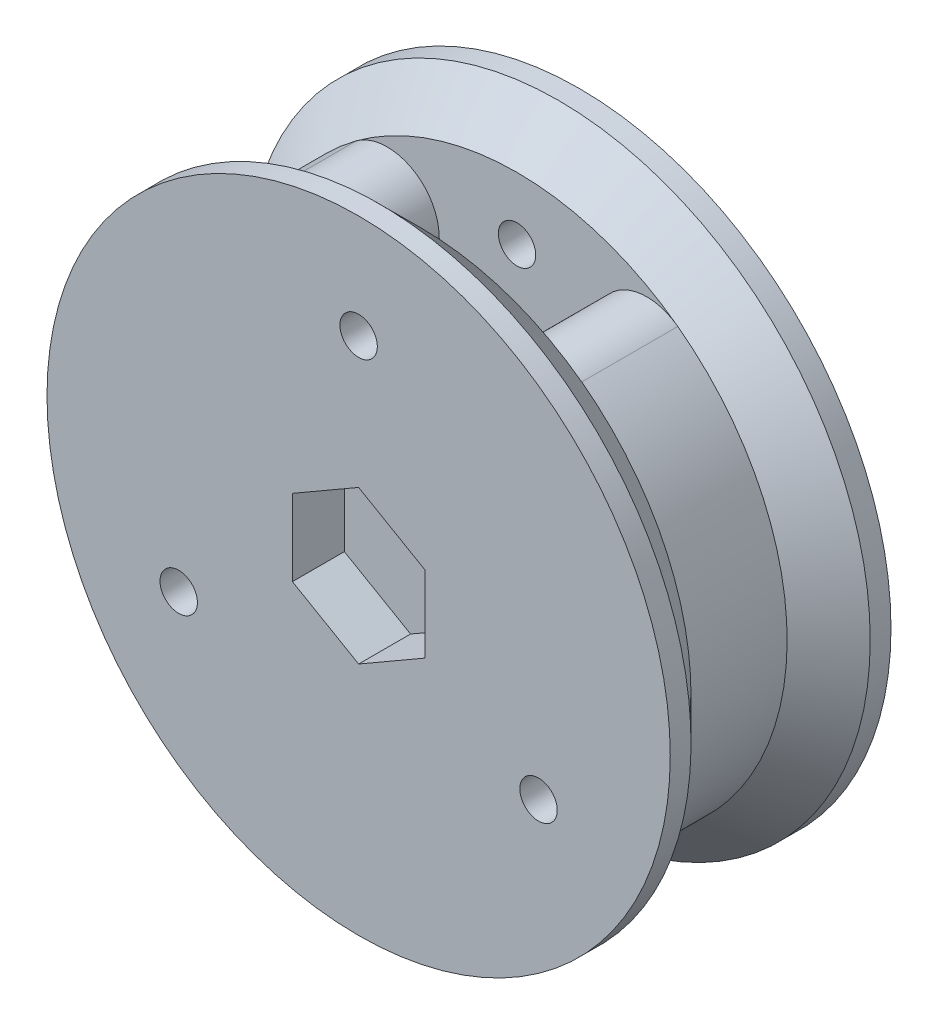
ISO-10303-21;
HEADER;
FILE_DESCRIPTION(('STEP AP214'),'2;1');
FILE_NAME('part.step','',(''),(''),'','','');
FILE_SCHEMA(('AUTOMOTIVE_DESIGN { 1 0 10303 214 1 1 1 1 }'));
ENDSEC;
DATA;
#1=APPLICATION_CONTEXT('core data for automotive mechanical design processes');
#2=APPLICATION_PROTOCOL_DEFINITION('international standard','automotive_design',2000,#1);
#3=PRODUCT_CONTEXT('',#1,'mechanical');
#4=PRODUCT('Part','Part','',(#3));
#5=PRODUCT_RELATED_PRODUCT_CATEGORY('part','',(#4));
#6=PRODUCT_DEFINITION_FORMATION('','',#4);
#7=PRODUCT_DEFINITION_CONTEXT('part definition',#1,'design');
#8=PRODUCT_DEFINITION('design','',#6,#7);
#9=PRODUCT_DEFINITION_SHAPE('','',#8);
#10=(LENGTH_UNIT() NAMED_UNIT(*) SI_UNIT(.MILLI.,.METRE.));
#11=(NAMED_UNIT(*) PLANE_ANGLE_UNIT() SI_UNIT($,.RADIAN.));
#12=(NAMED_UNIT(*) SI_UNIT($,.STERADIAN.) SOLID_ANGLE_UNIT());
#13=UNCERTAINTY_MEASURE_WITH_UNIT(LENGTH_MEASURE(1.E-05),#10,'distance_accuracy_value','');
#14=(GEOMETRIC_REPRESENTATION_CONTEXT(3) GLOBAL_UNCERTAINTY_ASSIGNED_CONTEXT((#13)) GLOBAL_UNIT_ASSIGNED_CONTEXT((#10,
#11,#12)) REPRESENTATION_CONTEXT('',''));
#15=CARTESIAN_POINT('',(0.,0.,0.));
#16=DIRECTION('',(0.,0.,1.));
#17=DIRECTION('',(1.,0.,0.));
#18=AXIS2_PLACEMENT_3D('',#15,#16,#17);
#19=CARTESIAN_POINT('',(0.,20.,0.));
#20=DIRECTION('',(0.,0.,1.));
#21=DIRECTION('',(1.,0.,0.));
#22=AXIS2_PLACEMENT_3D('',#19,#20,#21);
#23=CYLINDRICAL_SURFACE('',#22,1.8);
#24=CARTESIAN_POINT('',(0.,20.,6.00000000000006));
#25=DIRECTION('',(0.,0.,-1.));
#26=DIRECTION('',(-1.,0.,0.));
#27=AXIS2_PLACEMENT_3D('',#24,#25,#26);
#28=CIRCLE('',#27,1.8);
#29=CARTESIAN_POINT('',(-1.8,20.,6.00000000000006));
#30=VERTEX_POINT('',#29);
#31=EDGE_CURVE('E204',#30,#30,#28,.F.);
#32=ORIENTED_EDGE('',*,*,#31,.T.);
#33=EDGE_LOOP('',(#32));
#34=FACE_BOUND('',#33,.T.);
#35=CARTESIAN_POINT('',(0.,20.,0.));
#36=DIRECTION('',(0.,0.,1.));
#37=DIRECTION('',(1.,0.,0.));
#38=AXIS2_PLACEMENT_3D('',#35,#36,#37);
#39=CIRCLE('',#38,1.8);
#40=CARTESIAN_POINT('',(1.8,20.,0.));
#41=VERTEX_POINT('',#40);
#42=EDGE_CURVE('E231',#41,#41,#39,.T.);
#43=ORIENTED_EDGE('',*,*,#42,.F.);
#44=EDGE_LOOP('',(#43));
#45=FACE_BOUND('',#44,.T.);
#46=ADVANCED_FACE('F35',(#34,#45),#23,.F.);
#47=CARTESIAN_POINT('',(0.,0.,21.25));
#48=DIRECTION('',(0.,0.,-1.));
#49=DIRECTION('',(-1.,0.,0.));
#50=AXIS2_PLACEMENT_3D('',#47,#48,#49);
#51=CYLINDRICAL_SURFACE('',#50,30.);
#52=CARTESIAN_POINT('',(0.,0.,19.25));
#53=DIRECTION('',(0.,0.,-1.));
#54=DIRECTION('',(-1.,0.,0.));
#55=AXIS2_PLACEMENT_3D('',#52,#53,#54);
#56=CIRCLE('',#55,30.);
#57=CARTESIAN_POINT('',(-30.,0.,19.25));
#58=VERTEX_POINT('',#57);
#59=EDGE_CURVE('E244',#58,#58,#56,.T.);
#60=ORIENTED_EDGE('',*,*,#59,.F.);
#61=EDGE_LOOP('',(#60));
#62=FACE_BOUND('',#61,.T.);
#63=CARTESIAN_POINT('',(0.,0.,21.25));
#64=DIRECTION('',(0.,0.,1.));
#65=DIRECTION('',(1.,0.,0.));
#66=AXIS2_PLACEMENT_3D('',#63,#64,#65);
#67=CIRCLE('',#66,30.);
#68=CARTESIAN_POINT('',(30.,0.,21.25));
#69=VERTEX_POINT('',#68);
#70=EDGE_CURVE('E303',#69,#69,#67,.T.);
#71=ORIENTED_EDGE('',*,*,#70,.F.);
#72=EDGE_LOOP('',(#71));
#73=FACE_BOUND('',#72,.T.);
#74=ADVANCED_FACE('F388',(#62,#73),#51,.T.);
#75=CARTESIAN_POINT('',(0.,0.,21.25));
#76=DIRECTION('',(0.,0.,1.));
#77=DIRECTION('',(1.,0.,0.));
#78=AXIS2_PLACEMENT_3D('',#75,#76,#77);
#79=PLANE('',#78);
#80=CARTESIAN_POINT('',(-17.3205080756887,-10.0000000000001,21.25));
#81=DIRECTION('',(0.,0.,1.));
#82=DIRECTION('',(1.,0.,0.));
#83=AXIS2_PLACEMENT_3D('',#80,#81,#82);
#84=CIRCLE('',#83,1.8);
#85=CARTESIAN_POINT('',(-15.5205080756887,-10.0000000000001,21.25));
#86=VERTEX_POINT('',#85);
#87=EDGE_CURVE('E228',#86,#86,#84,.T.);
#88=ORIENTED_EDGE('',*,*,#87,.F.);
#89=EDGE_LOOP('',(#88));
#90=FACE_BOUND('',#89,.T.);
#91=CARTESIAN_POINT('',(0.,20.,21.25));
#92=DIRECTION('',(0.,0.,1.));
#93=DIRECTION('',(1.,0.,0.));
#94=AXIS2_PLACEMENT_3D('',#91,#92,#93);
#95=CIRCLE('',#94,1.8);
#96=CARTESIAN_POINT('',(1.8,20.,21.25));
#97=VERTEX_POINT('',#96);
#98=EDGE_CURVE('E234',#97,#97,#95,.T.);
#99=ORIENTED_EDGE('',*,*,#98,.F.);
#100=EDGE_LOOP('',(#99));
#101=FACE_BOUND('',#100,.T.);
#102=CARTESIAN_POINT('',(17.3205080756889,-9.99999999999983,21.25));
#103=DIRECTION('',(0.,0.,1.));
#104=DIRECTION('',(1.,0.,0.));
#105=AXIS2_PLACEMENT_3D('',#102,#103,#104);
#106=CIRCLE('',#105,1.8);
#107=CARTESIAN_POINT('',(19.1205080756889,-9.99999999999983,21.25));
#108=VERTEX_POINT('',#107);
#109=EDGE_CURVE('E216',#108,#108,#106,.T.);
#110=ORIENTED_EDGE('',*,*,#109,.F.);
#111=EDGE_LOOP('',(#110));
#112=FACE_BOUND('',#111,.T.);
#113=DIRECTION('',(-0.866025403784439,0.5,0.));
#114=VECTOR('',#113,1.);
#115=CARTESIAN_POINT('',(6.375,3.68060796608387,21.25));
#116=LINE('',#115,#114);
#117=CARTESIAN_POINT('',(6.375,3.68060796608387,21.25));
#118=VERTEX_POINT('',#117);
#119=CARTESIAN_POINT('',(0.,7.36121593216773,21.25));
#120=VERTEX_POINT('',#119);
#121=EDGE_CURVE('E254',#118,#120,#116,.T.);
#122=ORIENTED_EDGE('',*,*,#121,.F.);
#123=DIRECTION('',(0.,1.,0.));
#124=VECTOR('',#123,1.);
#125=CARTESIAN_POINT('',(6.375,-3.68060796608386,21.25));
#126=LINE('',#125,#124);
#127=CARTESIAN_POINT('',(6.375,-3.68060796608386,21.25));
#128=VERTEX_POINT('',#127);
#129=EDGE_CURVE('E259',#128,#118,#126,.T.);
#130=ORIENTED_EDGE('',*,*,#129,.F.);
#131=DIRECTION('',(0.866025403784439,0.5,0.));
#132=VECTOR('',#131,1.);
#133=CARTESIAN_POINT('',(0.,-7.36121593216773,21.25));
#134=LINE('',#133,#132);
#135=CARTESIAN_POINT('',(0.,-7.36121593216773,21.25));
#136=VERTEX_POINT('',#135);
#137=EDGE_CURVE('E285',#136,#128,#134,.T.);
#138=ORIENTED_EDGE('',*,*,#137,.F.);
#139=DIRECTION('',(0.866025403784439,-0.5,0.));
#140=VECTOR('',#139,1.);
#141=CARTESIAN_POINT('',(-6.375,-3.68060796608386,21.25));
#142=LINE('',#141,#140);
#143=CARTESIAN_POINT('',(-6.375,-3.68060796608386,21.25));
#144=VERTEX_POINT('',#143);
#145=EDGE_CURVE('E282',#144,#136,#142,.T.);
#146=ORIENTED_EDGE('',*,*,#145,.F.);
#147=DIRECTION('',(0.,-1.,0.));
#148=VECTOR('',#147,1.);
#149=CARTESIAN_POINT('',(-6.375,3.68060796608386,21.25));
#150=LINE('',#149,#148);
#151=CARTESIAN_POINT('',(-6.375,3.68060796608386,21.25));
#152=VERTEX_POINT('',#151);
#153=EDGE_CURVE('E279',#152,#144,#150,.T.);
#154=ORIENTED_EDGE('',*,*,#153,.F.);
#155=DIRECTION('',(-0.866025403784439,-0.5,0.));
#156=VECTOR('',#155,1.);
#157=CARTESIAN_POINT('',(0.,7.36121593216773,21.25));
#158=LINE('',#157,#156);
#159=EDGE_CURVE('E276',#120,#152,#158,.T.);
#160=ORIENTED_EDGE('',*,*,#159,.F.);
#161=EDGE_LOOP('',(#122,#130,#138,#146,#154,#160));
#162=FACE_BOUND('',#161,.T.);
#163=ORIENTED_EDGE('',*,*,#70,.T.);
#164=EDGE_LOOP('',(#163));
#165=FACE_BOUND('',#164,.T.);
#166=ADVANCED_FACE('F395',(#90,#101,#112,#162,#165),#79,.T.);
#167=CARTESIAN_POINT('',(6.375,3.68060796608387,16.25));
#168=DIRECTION('',(0.5,0.866025403784439,0.));
#169=DIRECTION('',(-0.866025403784439,0.5,0.));
#170=AXIS2_PLACEMENT_3D('',#167,#168,#169);
#171=PLANE('',#170);
#172=ORIENTED_EDGE('',*,*,#121,.T.);
#173=DIRECTION('',(0.,0.,1.));
#174=VECTOR('',#173,1.);
#175=CARTESIAN_POINT('',(0.,7.36121593216773,16.25));
#176=LINE('',#175,#174);
#177=CARTESIAN_POINT('',(0.,7.36121593216773,16.25));
#178=VERTEX_POINT('',#177);
#179=EDGE_CURVE('E274',#178,#120,#176,.T.);
#180=ORIENTED_EDGE('',*,*,#179,.F.);
#181=DIRECTION('',(-0.866025403784439,0.5,0.));
#182=VECTOR('',#181,1.);
#183=CARTESIAN_POINT('',(6.375,3.68060796608387,16.25));
#184=LINE('',#183,#182);
#185=CARTESIAN_POINT('',(6.375,3.68060796608387,16.25));
#186=VERTEX_POINT('',#185);
#187=EDGE_CURVE('E255',#186,#178,#184,.T.);
#188=ORIENTED_EDGE('',*,*,#187,.F.);
#189=DIRECTION('',(0.,0.,1.));
#190=VECTOR('',#189,1.);
#191=CARTESIAN_POINT('',(6.375,3.68060796608387,16.25));
#192=LINE('',#191,#190);
#193=EDGE_CURVE('E290',#186,#118,#192,.T.);
#194=ORIENTED_EDGE('',*,*,#193,.T.);
#195=EDGE_LOOP('',(#172,#180,#188,#194));
#196=FACE_BOUND('',#195,.T.);
#197=ADVANCED_FACE('F418',(#196),#171,.F.);
#198=CARTESIAN_POINT('',(6.375,-3.68060796608386,16.25));
#199=DIRECTION('',(1.,0.,0.));
#200=DIRECTION('',(0.,1.,0.));
#201=AXIS2_PLACEMENT_3D('',#198,#199,#200);
#202=PLANE('',#201);
#203=ORIENTED_EDGE('',*,*,#129,.T.);
#204=ORIENTED_EDGE('',*,*,#193,.F.);
#205=DIRECTION('',(0.,1.,0.));
#206=VECTOR('',#205,1.);
#207=CARTESIAN_POINT('',(6.375,-3.68060796608386,16.25));
#208=LINE('',#207,#206);
#209=CARTESIAN_POINT('',(6.375,-3.68060796608386,16.25));
#210=VERTEX_POINT('',#209);
#211=EDGE_CURVE('E271',#210,#186,#208,.T.);
#212=ORIENTED_EDGE('',*,*,#211,.F.);
#213=DIRECTION('',(0.,0.,1.));
#214=VECTOR('',#213,1.);
#215=CARTESIAN_POINT('',(6.375,-3.68060796608386,16.25));
#216=LINE('',#215,#214);
#217=EDGE_CURVE('E293',#210,#128,#216,.T.);
#218=ORIENTED_EDGE('',*,*,#217,.T.);
#219=EDGE_LOOP('',(#203,#204,#212,#218));
#220=FACE_BOUND('',#219,.T.);
#221=ADVANCED_FACE('F439',(#220),#202,.F.);
#222=CARTESIAN_POINT('',(0.,-7.36121593216773,16.25));
#223=DIRECTION('',(0.5,-0.866025403784439,0.));
#224=DIRECTION('',(0.866025403784439,0.5,0.));
#225=AXIS2_PLACEMENT_3D('',#222,#223,#224);
#226=PLANE('',#225);
#227=ORIENTED_EDGE('',*,*,#137,.T.);
#228=ORIENTED_EDGE('',*,*,#217,.F.);
#229=DIRECTION('',(0.866025403784439,0.5,0.));
#230=VECTOR('',#229,1.);
#231=CARTESIAN_POINT('',(0.,-7.36121593216773,16.25));
#232=LINE('',#231,#230);
#233=CARTESIAN_POINT('',(0.,-7.36121593216773,16.25));
#234=VERTEX_POINT('',#233);
#235=EDGE_CURVE('E268',#234,#210,#232,.T.);
#236=ORIENTED_EDGE('',*,*,#235,.F.);
#237=DIRECTION('',(0.,0.,1.));
#238=VECTOR('',#237,1.);
#239=CARTESIAN_POINT('',(0.,-7.36121593216773,16.25));
#240=LINE('',#239,#238);
#241=EDGE_CURVE('E295',#234,#136,#240,.T.);
#242=ORIENTED_EDGE('',*,*,#241,.T.);
#243=EDGE_LOOP('',(#227,#228,#236,#242));
#244=FACE_BOUND('',#243,.T.);
#245=ADVANCED_FACE('F441',(#244),#226,.F.);
#246=CARTESIAN_POINT('',(-6.375,-3.68060796608386,16.25));
#247=DIRECTION('',(-0.5,-0.866025403784439,0.));
#248=DIRECTION('',(0.866025403784439,-0.5,0.));
#249=AXIS2_PLACEMENT_3D('',#246,#247,#248);
#250=PLANE('',#249);
#251=ORIENTED_EDGE('',*,*,#145,.T.);
#252=ORIENTED_EDGE('',*,*,#241,.F.);
#253=DIRECTION('',(0.866025403784439,-0.5,0.));
#254=VECTOR('',#253,1.);
#255=CARTESIAN_POINT('',(-6.375,-3.68060796608386,16.25));
#256=LINE('',#255,#254);
#257=CARTESIAN_POINT('',(-6.375,-3.68060796608386,16.25));
#258=VERTEX_POINT('',#257);
#259=EDGE_CURVE('E265',#258,#234,#256,.T.);
#260=ORIENTED_EDGE('',*,*,#259,.F.);
#261=DIRECTION('',(0.,0.,1.));
#262=VECTOR('',#261,1.);
#263=CARTESIAN_POINT('',(-6.375,-3.68060796608386,16.25));
#264=LINE('',#263,#262);
#265=EDGE_CURVE('E297',#258,#144,#264,.T.);
#266=ORIENTED_EDGE('',*,*,#265,.T.);
#267=EDGE_LOOP('',(#251,#252,#260,#266));
#268=FACE_BOUND('',#267,.T.);
#269=ADVANCED_FACE('F444',(#268),#250,.F.);
#270=CARTESIAN_POINT('',(-6.375,3.68060796608386,16.25));
#271=DIRECTION('',(-1.,0.,0.));
#272=DIRECTION('',(0.,0.,1.));
#273=AXIS2_PLACEMENT_3D('',#270,#271,#272);
#274=PLANE('',#273);
#275=ORIENTED_EDGE('',*,*,#153,.T.);
#276=ORIENTED_EDGE('',*,*,#265,.F.);
#277=DIRECTION('',(0.,-1.,0.));
#278=VECTOR('',#277,1.);
#279=CARTESIAN_POINT('',(-6.375,3.68060796608386,16.25));
#280=LINE('',#279,#278);
#281=CARTESIAN_POINT('',(-6.375,3.68060796608386,16.25));
#282=VERTEX_POINT('',#281);
#283=EDGE_CURVE('E262',#282,#258,#280,.T.);
#284=ORIENTED_EDGE('',*,*,#283,.F.);
#285=DIRECTION('',(0.,0.,1.));
#286=VECTOR('',#285,1.);
#287=CARTESIAN_POINT('',(-6.375,3.68060796608386,16.25));
#288=LINE('',#287,#286);
#289=EDGE_CURVE('E299',#282,#152,#288,.T.);
#290=ORIENTED_EDGE('',*,*,#289,.T.);
#291=EDGE_LOOP('',(#275,#276,#284,#290));
#292=FACE_BOUND('',#291,.T.);
#293=ADVANCED_FACE('F447',(#292),#274,.F.);
#294=CARTESIAN_POINT('',(0.,7.36121593216773,16.25));
#295=DIRECTION('',(-0.5,0.866025403784439,0.));
#296=DIRECTION('',(-0.866025403784439,-0.5,0.));
#297=AXIS2_PLACEMENT_3D('',#294,#295,#296);
#298=PLANE('',#297);
#299=ORIENTED_EDGE('',*,*,#159,.T.);
#300=ORIENTED_EDGE('',*,*,#289,.F.);
#301=DIRECTION('',(-0.866025403784439,-0.5,0.));
#302=VECTOR('',#301,1.);
#303=CARTESIAN_POINT('',(0.,7.36121593216773,16.25));
#304=LINE('',#303,#302);
#305=EDGE_CURVE('E258',#178,#282,#304,.T.);
#306=ORIENTED_EDGE('',*,*,#305,.F.);
#307=ORIENTED_EDGE('',*,*,#179,.T.);
#308=EDGE_LOOP('',(#299,#300,#306,#307));
#309=FACE_BOUND('',#308,.T.);
#310=ADVANCED_FACE('F383',(#309),#298,.F.);
#311=CARTESIAN_POINT('',(0.,0.,16.25));
#312=DIRECTION('',(0.,0.,1.));
#313=DIRECTION('',(1.,0.,0.));
#314=AXIS2_PLACEMENT_3D('',#311,#312,#313);
#315=PLANE('',#314);
#316=ORIENTED_EDGE('',*,*,#187,.T.);
#317=ORIENTED_EDGE('',*,*,#305,.T.);
#318=ORIENTED_EDGE('',*,*,#283,.T.);
#319=ORIENTED_EDGE('',*,*,#259,.T.);
#320=ORIENTED_EDGE('',*,*,#235,.T.);
#321=ORIENTED_EDGE('',*,*,#211,.T.);
#322=EDGE_LOOP('',(#316,#317,#318,#319,#320,#321));
#323=FACE_BOUND('',#322,.T.);
#324=ADVANCED_FACE('F375',(#323),#315,.T.);
#325=CARTESIAN_POINT('',(0.,0.,6.00000000000005));
#326=DIRECTION('',(0.,0.,-1.));
#327=DIRECTION('',(-1.,0.,0.));
#328=AXIS2_PLACEMENT_3D('',#325,#326,#327);
#329=CONICAL_SURFACE('',#328,26.,0.785398163397443);
#330=CARTESIAN_POINT('',(0.,0.,2.));
#331=DIRECTION('',(0.,0.,-1.));
#332=DIRECTION('',(-1.,0.,0.));
#333=AXIS2_PLACEMENT_3D('',#330,#331,#332);
#334=CIRCLE('',#333,30.);
#335=CARTESIAN_POINT('',(-30.,0.,2.));
#336=VERTEX_POINT('',#335);
#337=EDGE_CURVE('E227',#336,#336,#334,.T.);
#338=ORIENTED_EDGE('',*,*,#337,.F.);
#339=EDGE_LOOP('',(#338));
#340=FACE_BOUND('',#339,.T.);
#341=CARTESIAN_POINT('',(0.,0.,6.00000000000005));
#342=DIRECTION('',(0.,0.,-1.));
#343=DIRECTION('',(-1.,0.,0.));
#344=AXIS2_PLACEMENT_3D('',#341,#342,#343);
#345=CIRCLE('',#344,26.);
#346=CARTESIAN_POINT('',(-15.4761904761905,20.8922839427543,6.00000000000005));
#347=VERTEX_POINT('',#346);
#348=CARTESIAN_POINT('',(15.4761904761905,20.8922839427543,6.00000000000005));
#349=VERTEX_POINT('',#348);
#350=EDGE_CURVE('E251',#347,#349,#345,.T.);
#351=ORIENTED_EDGE('',*,*,#350,.T.);
#352=EDGE_CURVE('E250',#349,#347,#345,.T.);
#353=ORIENTED_EDGE('',*,*,#352,.T.);
#354=EDGE_LOOP('',(#351,#353));
#355=FACE_BOUND('',#354,.T.);
#356=ADVANCED_FACE('F373',(#340,#355),#329,.T.);
#357=CARTESIAN_POINT('',(0.,0.,-12.6406174798319));
#358=DIRECTION('',(0.,0.,-1.));
#359=DIRECTION('',(-1.,0.,0.));
#360=AXIS2_PLACEMENT_3D('',#357,#358,#359);
#361=CYLINDRICAL_SURFACE('',#360,26.);
#362=ORIENTED_EDGE('',*,*,#352,.F.);
#363=DIRECTION('',(0.,0.,-1.));
#364=VECTOR('',#363,1.);
#365=CARTESIAN_POINT('',(15.4761904761905,20.8922839427543,-12.6406174798319));
#366=LINE('',#365,#364);
#367=CARTESIAN_POINT('',(15.4761904761905,20.8922839427543,15.25));
#368=VERTEX_POINT('',#367);
#369=EDGE_CURVE('E316',#349,#368,#366,.F.);
#370=ORIENTED_EDGE('',*,*,#369,.T.);
#371=CARTESIAN_POINT('',(0.,0.,15.25));
#372=DIRECTION('',(0.,0.,-1.));
#373=DIRECTION('',(-1.,0.,0.));
#374=AXIS2_PLACEMENT_3D('',#371,#372,#373);
#375=CIRCLE('',#374,26.);
#376=CARTESIAN_POINT('',(-15.4761904761905,20.8922839427543,15.25));
#377=VERTEX_POINT('',#376);
#378=EDGE_CURVE('E247',#368,#377,#375,.T.);
#379=ORIENTED_EDGE('',*,*,#378,.T.);
#380=DIRECTION('',(0.,0.,-1.));
#381=VECTOR('',#380,1.);
#382=CARTESIAN_POINT('',(-15.4761904761905,20.8922839427543,-12.6406174798319));
#383=LINE('',#382,#381);
#384=EDGE_CURVE('E306',#377,#347,#383,.T.);
#385=ORIENTED_EDGE('',*,*,#384,.T.);
#386=EDGE_LOOP('',(#362,#370,#379,#385));
#387=FACE_BOUND('',#386,.T.);
#388=ADVANCED_FACE('F359',(#387),#361,.T.);
#389=CARTESIAN_POINT('',(0.,0.,19.25));
#390=DIRECTION('',(0.,0.,1.));
#391=DIRECTION('',(1.,0.,0.));
#392=AXIS2_PLACEMENT_3D('',#389,#390,#391);
#393=CONICAL_SURFACE('',#392,30.,0.785398163397443);
#394=EDGE_CURVE('E248',#377,#368,#375,.T.);
#395=ORIENTED_EDGE('',*,*,#394,.F.);
#396=ORIENTED_EDGE('',*,*,#378,.F.);
#397=EDGE_LOOP('',(#395,#396));
#398=FACE_BOUND('',#397,.T.);
#399=ORIENTED_EDGE('',*,*,#59,.T.);
#400=EDGE_LOOP('',(#399));
#401=FACE_BOUND('',#400,.T.);
#402=ADVANCED_FACE('F364',(#398,#401),#393,.T.);
#403=CARTESIAN_POINT('',(0.,0.,0.));
#404=DIRECTION('',(0.,0.,1.));
#405=DIRECTION('',(1.,0.,0.));
#406=AXIS2_PLACEMENT_3D('',#403,#404,#405);
#407=PLANE('',#406);
#408=DIRECTION('',(0.5,0.866025403784439,0.));
#409=VECTOR('',#408,1.);
#410=CARTESIAN_POINT('',(-7.36121593216773,0.,0.));
#411=LINE('',#410,#409);
#412=CARTESIAN_POINT('',(-7.36121593216773,0.,0.));
#413=VERTEX_POINT('',#412);
#414=CARTESIAN_POINT('',(-3.68060796608386,6.375,0.));
#415=VERTEX_POINT('',#414);
#416=EDGE_CURVE('E203',#413,#415,#411,.T.);
#417=ORIENTED_EDGE('',*,*,#416,.F.);
#418=DIRECTION('',(-0.499999999999999,0.866025403784439,0.));
#419=VECTOR('',#418,1.);
#420=CARTESIAN_POINT('',(-3.68060796608386,-6.375,0.));
#421=LINE('',#420,#419);
#422=CARTESIAN_POINT('',(-3.68060796608386,-6.375,0.));
#423=VERTEX_POINT('',#422);
#424=EDGE_CURVE('E168',#423,#413,#421,.T.);
#425=ORIENTED_EDGE('',*,*,#424,.F.);
#426=DIRECTION('',(-1.,0.,0.));
#427=VECTOR('',#426,1.);
#428=CARTESIAN_POINT('',(3.68060796608387,-6.375,0.));
#429=LINE('',#428,#427);
#430=CARTESIAN_POINT('',(3.68060796608387,-6.375,0.));
#431=VERTEX_POINT('',#430);
#432=EDGE_CURVE('E186',#431,#423,#429,.T.);
#433=ORIENTED_EDGE('',*,*,#432,.F.);
#434=DIRECTION('',(-0.5,-0.866025403784439,0.));
#435=VECTOR('',#434,1.);
#436=CARTESIAN_POINT('',(7.36121593216773,0.,0.));
#437=LINE('',#436,#435);
#438=CARTESIAN_POINT('',(7.36121593216773,0.,0.));
#439=VERTEX_POINT('',#438);
#440=EDGE_CURVE('E189',#439,#431,#437,.T.);
#441=ORIENTED_EDGE('',*,*,#440,.F.);
#442=DIRECTION('',(0.5,-0.866025403784439,0.));
#443=VECTOR('',#442,1.);
#444=CARTESIAN_POINT('',(3.68060796608386,6.375,0.));
#445=LINE('',#444,#443);
#446=CARTESIAN_POINT('',(3.68060796608386,6.375,0.));
#447=VERTEX_POINT('',#446);
#448=EDGE_CURVE('E209',#447,#439,#445,.T.);
#449=ORIENTED_EDGE('',*,*,#448,.F.);
#450=DIRECTION('',(1.,0.,0.));
#451=VECTOR('',#450,1.);
#452=CARTESIAN_POINT('',(-3.68060796608386,6.375,0.));
#453=LINE('',#452,#451);
#454=EDGE_CURVE('E206',#415,#447,#453,.T.);
#455=ORIENTED_EDGE('',*,*,#454,.F.);
#456=EDGE_LOOP('',(#417,#425,#433,#441,#449,#455));
#457=FACE_BOUND('',#456,.T.);
#458=CARTESIAN_POINT('',(-17.3205080756887,-10.0000000000001,0.));
#459=DIRECTION('',(0.,0.,1.));
#460=DIRECTION('',(1.,0.,0.));
#461=AXIS2_PLACEMENT_3D('',#458,#459,#460);
#462=CIRCLE('',#461,1.8);
#463=CARTESIAN_POINT('',(-15.5205080756887,-10.0000000000001,0.));
#464=VERTEX_POINT('',#463);
#465=EDGE_CURVE('E224',#464,#464,#462,.T.);
#466=ORIENTED_EDGE('',*,*,#465,.T.);
#467=EDGE_LOOP('',(#466));
#468=FACE_BOUND('',#467,.T.);
#469=ORIENTED_EDGE('',*,*,#42,.T.);
#470=EDGE_LOOP('',(#469));
#471=FACE_BOUND('',#470,.T.);
#472=CARTESIAN_POINT('',(17.3205080756889,-9.99999999999983,0.));
#473=DIRECTION('',(0.,0.,1.));
#474=DIRECTION('',(1.,0.,0.));
#475=AXIS2_PLACEMENT_3D('',#472,#473,#474);
#476=CIRCLE('',#475,1.8);
#477=CARTESIAN_POINT('',(19.1205080756889,-9.99999999999983,0.));
#478=VERTEX_POINT('',#477);
#479=EDGE_CURVE('E237',#478,#478,#476,.T.);
#480=ORIENTED_EDGE('',*,*,#479,.T.);
#481=EDGE_LOOP('',(#480));
#482=FACE_BOUND('',#481,.T.);
#483=CARTESIAN_POINT('',(0.,0.,0.));
#484=DIRECTION('',(0.,0.,1.));
#485=DIRECTION('',(1.,0.,0.));
#486=AXIS2_PLACEMENT_3D('',#483,#484,#485);
#487=CIRCLE('',#486,30.);
#488=CARTESIAN_POINT('',(30.,0.,0.));
#489=VERTEX_POINT('',#488);
#490=EDGE_CURVE('E292',#489,#489,#487,.T.);
#491=ORIENTED_EDGE('',*,*,#490,.F.);
#492=EDGE_LOOP('',(#491));
#493=FACE_BOUND('',#492,.T.);
#494=ADVANCED_FACE('F460',(#457,#468,#471,#482,#493),#407,.F.);
#495=ORIENTED_EDGE('',*,*,#337,.T.);
#496=EDGE_LOOP('',(#495));
#497=FACE_BOUND('',#496,.T.);
#498=ORIENTED_EDGE('',*,*,#490,.T.);
#499=EDGE_LOOP('',(#498));
#500=FACE_BOUND('',#499,.T.);
#501=ADVANCED_FACE('F398',(#497,#500),#51,.T.);
#502=CARTESIAN_POINT('',(17.3205080756889,-9.99999999999983,0.));
#503=DIRECTION('',(0.,0.,1.));
#504=DIRECTION('',(1.,0.,0.));
#505=AXIS2_PLACEMENT_3D('',#502,#503,#504);
#506=CYLINDRICAL_SURFACE('',#505,1.8);
#507=ORIENTED_EDGE('',*,*,#479,.F.);
#508=EDGE_LOOP('',(#507));
#509=FACE_BOUND('',#508,.T.);
#510=ORIENTED_EDGE('',*,*,#109,.T.);
#511=EDGE_LOOP('',(#510));
#512=FACE_BOUND('',#511,.T.);
#513=ADVANCED_FACE('F404',(#509,#512),#506,.F.);
#514=CARTESIAN_POINT('',(0.,20.,15.25));
#515=DIRECTION('',(0.,0.,1.));
#516=DIRECTION('',(1.,0.,0.));
#517=AXIS2_PLACEMENT_3D('',#514,#515,#516);
#518=CIRCLE('',#517,1.8);
#519=CARTESIAN_POINT('',(1.8,20.,15.25));
#520=VERTEX_POINT('',#519);
#521=EDGE_CURVE('E309',#520,#520,#518,.F.);
#522=ORIENTED_EDGE('',*,*,#521,.T.);
#523=EDGE_LOOP('',(#522));
#524=FACE_BOUND('',#523,.T.);
#525=ORIENTED_EDGE('',*,*,#98,.T.);
#526=EDGE_LOOP('',(#525));
#527=FACE_BOUND('',#526,.T.);
#528=ADVANCED_FACE('F391',(#524,#527),#23,.F.);
#529=CARTESIAN_POINT('',(-17.3205080756887,-10.0000000000001,0.));
#530=DIRECTION('',(0.,0.,1.));
#531=DIRECTION('',(1.,0.,0.));
#532=AXIS2_PLACEMENT_3D('',#529,#530,#531);
#533=CYLINDRICAL_SURFACE('',#532,1.8);
#534=ORIENTED_EDGE('',*,*,#465,.F.);
#535=EDGE_LOOP('',(#534));
#536=FACE_BOUND('',#535,.T.);
#537=ORIENTED_EDGE('',*,*,#87,.T.);
#538=EDGE_LOOP('',(#537));
#539=FACE_BOUND('',#538,.T.);
#540=ADVANCED_FACE('F403',(#536,#539),#533,.F.);
#541=CARTESIAN_POINT('',(-3.68060796608386,-6.375,13.));
#542=DIRECTION('',(-0.866025403784439,-0.5,0.));
#543=DIRECTION('',(0.5,-0.866025403784439,0.));
#544=AXIS2_PLACEMENT_3D('',#541,#542,#543);
#545=PLANE('',#544);
#546=ORIENTED_EDGE('',*,*,#424,.T.);
#547=DIRECTION('',(0.,0.,-1.));
#548=VECTOR('',#547,1.);
#549=CARTESIAN_POINT('',(-7.36121593216773,0.,13.));
#550=LINE('',#549,#548);
#551=CARTESIAN_POINT('',(-7.36121593216773,0.,13.));
#552=VERTEX_POINT('',#551);
#553=EDGE_CURVE('E161',#552,#413,#550,.T.);
#554=ORIENTED_EDGE('',*,*,#553,.F.);
#555=DIRECTION('',(-0.499999999999999,0.866025403784439,0.));
#556=VECTOR('',#555,1.);
#557=CARTESIAN_POINT('',(-3.68060796608386,-6.375,13.));
#558=LINE('',#557,#556);
#559=CARTESIAN_POINT('',(-3.68060796608386,-6.375,13.));
#560=VERTEX_POINT('',#559);
#561=EDGE_CURVE('E165',#560,#552,#558,.T.);
#562=ORIENTED_EDGE('',*,*,#561,.F.);
#563=DIRECTION('',(0.,0.,-1.));
#564=VECTOR('',#563,1.);
#565=CARTESIAN_POINT('',(-3.68060796608386,-6.375,13.));
#566=LINE('',#565,#564);
#567=EDGE_CURVE('E214',#560,#423,#566,.T.);
#568=ORIENTED_EDGE('',*,*,#567,.T.);
#569=EDGE_LOOP('',(#546,#554,#562,#568));
#570=FACE_BOUND('',#569,.T.);
#571=ADVANCED_FACE('F163',(#570),#545,.F.);
#572=CARTESIAN_POINT('',(3.68060796608387,-6.375,13.));
#573=DIRECTION('',(0.,-1.,0.));
#574=DIRECTION('',(1.,0.,0.));
#575=AXIS2_PLACEMENT_3D('',#572,#573,#574);
#576=PLANE('',#575);
#577=ORIENTED_EDGE('',*,*,#432,.T.);
#578=ORIENTED_EDGE('',*,*,#567,.F.);
#579=DIRECTION('',(-1.,0.,0.));
#580=VECTOR('',#579,1.);
#581=CARTESIAN_POINT('',(3.68060796608387,-6.375,13.));
#582=LINE('',#581,#580);
#583=CARTESIAN_POINT('',(3.68060796608387,-6.375,13.));
#584=VERTEX_POINT('',#583);
#585=EDGE_CURVE('E173',#584,#560,#582,.T.);
#586=ORIENTED_EDGE('',*,*,#585,.F.);
#587=DIRECTION('',(0.,0.,-1.));
#588=VECTOR('',#587,1.);
#589=CARTESIAN_POINT('',(3.68060796608387,-6.375,13.));
#590=LINE('',#589,#588);
#591=EDGE_CURVE('E217',#584,#431,#590,.T.);
#592=ORIENTED_EDGE('',*,*,#591,.T.);
#593=EDGE_LOOP('',(#577,#578,#586,#592));
#594=FACE_BOUND('',#593,.T.);
#595=ADVANCED_FACE('F590',(#594),#576,.F.);
#596=CARTESIAN_POINT('',(7.36121593216773,0.,13.));
#597=DIRECTION('',(0.866025403784439,-0.5,0.));
#598=DIRECTION('',(0.5,0.866025403784439,0.));
#599=AXIS2_PLACEMENT_3D('',#596,#597,#598);
#600=PLANE('',#599);
#601=ORIENTED_EDGE('',*,*,#440,.T.);
#602=ORIENTED_EDGE('',*,*,#591,.F.);
#603=DIRECTION('',(-0.5,-0.866025403784439,0.));
#604=VECTOR('',#603,1.);
#605=CARTESIAN_POINT('',(7.36121593216773,0.,13.));
#606=LINE('',#605,#604);
#607=CARTESIAN_POINT('',(7.36121593216773,0.,13.));
#608=VERTEX_POINT('',#607);
#609=EDGE_CURVE('E199',#608,#584,#606,.T.);
#610=ORIENTED_EDGE('',*,*,#609,.F.);
#611=DIRECTION('',(0.,0.,-1.));
#612=VECTOR('',#611,1.);
#613=CARTESIAN_POINT('',(7.36121593216773,0.,13.));
#614=LINE('',#613,#612);
#615=EDGE_CURVE('E219',#608,#439,#614,.T.);
#616=ORIENTED_EDGE('',*,*,#615,.T.);
#617=EDGE_LOOP('',(#601,#602,#610,#616));
#618=FACE_BOUND('',#617,.T.);
#619=ADVANCED_FACE('F580',(#618),#600,.F.);
#620=CARTESIAN_POINT('',(3.68060796608386,6.375,13.));
#621=DIRECTION('',(0.866025403784439,0.5,0.));
#622=DIRECTION('',(-0.5,0.866025403784439,0.));
#623=AXIS2_PLACEMENT_3D('',#620,#621,#622);
#624=PLANE('',#623);
#625=ORIENTED_EDGE('',*,*,#448,.T.);
#626=ORIENTED_EDGE('',*,*,#615,.F.);
#627=DIRECTION('',(0.5,-0.866025403784439,0.));
#628=VECTOR('',#627,1.);
#629=CARTESIAN_POINT('',(3.68060796608386,6.375,13.));
#630=LINE('',#629,#628);
#631=CARTESIAN_POINT('',(3.68060796608386,6.375,13.));
#632=VERTEX_POINT('',#631);
#633=EDGE_CURVE('E196',#632,#608,#630,.T.);
#634=ORIENTED_EDGE('',*,*,#633,.F.);
#635=DIRECTION('',(0.,0.,-1.));
#636=VECTOR('',#635,1.);
#637=CARTESIAN_POINT('',(3.68060796608386,6.375,13.));
#638=LINE('',#637,#636);
#639=EDGE_CURVE('E221',#632,#447,#638,.T.);
#640=ORIENTED_EDGE('',*,*,#639,.T.);
#641=EDGE_LOOP('',(#625,#626,#634,#640));
#642=FACE_BOUND('',#641,.T.);
#643=ADVANCED_FACE('F570',(#642),#624,.F.);
#644=CARTESIAN_POINT('',(-3.68060796608386,6.375,13.));
#645=DIRECTION('',(0.,1.,0.));
#646=DIRECTION('',(-1.,0.,0.));
#647=AXIS2_PLACEMENT_3D('',#644,#645,#646);
#648=PLANE('',#647);
#649=ORIENTED_EDGE('',*,*,#454,.T.);
#650=ORIENTED_EDGE('',*,*,#639,.F.);
#651=DIRECTION('',(1.,0.,0.));
#652=VECTOR('',#651,1.);
#653=CARTESIAN_POINT('',(-3.68060796608386,6.375,13.));
#654=LINE('',#653,#652);
#655=CARTESIAN_POINT('',(-3.68060796608386,6.375,13.));
#656=VERTEX_POINT('',#655);
#657=EDGE_CURVE('E181',#656,#632,#654,.T.);
#658=ORIENTED_EDGE('',*,*,#657,.F.);
#659=DIRECTION('',(0.,0.,-1.));
#660=VECTOR('',#659,1.);
#661=CARTESIAN_POINT('',(-3.68060796608386,6.375,13.));
#662=LINE('',#661,#660);
#663=EDGE_CURVE('E172',#656,#415,#662,.T.);
#664=ORIENTED_EDGE('',*,*,#663,.T.);
#665=EDGE_LOOP('',(#649,#650,#658,#664));
#666=FACE_BOUND('',#665,.T.);
#667=ADVANCED_FACE('F561',(#666),#648,.F.);
#668=CARTESIAN_POINT('',(-7.36121593216773,0.,13.));
#669=DIRECTION('',(-0.866025403784439,0.5,0.));
#670=DIRECTION('',(-0.5,-0.866025403784439,0.));
#671=AXIS2_PLACEMENT_3D('',#668,#669,#670);
#672=PLANE('',#671);
#673=ORIENTED_EDGE('',*,*,#416,.T.);
#674=ORIENTED_EDGE('',*,*,#663,.F.);
#675=DIRECTION('',(0.5,0.866025403784439,0.));
#676=VECTOR('',#675,1.);
#677=CARTESIAN_POINT('',(-7.36121593216773,0.,13.));
#678=LINE('',#677,#676);
#679=EDGE_CURVE('E176',#552,#656,#678,.T.);
#680=ORIENTED_EDGE('',*,*,#679,.F.);
#681=ORIENTED_EDGE('',*,*,#553,.T.);
#682=EDGE_LOOP('',(#673,#674,#680,#681));
#683=FACE_BOUND('',#682,.T.);
#684=ADVANCED_FACE('F177',(#683),#672,.F.);
#685=CARTESIAN_POINT('',(0.,0.,13.));
#686=DIRECTION('',(0.,0.,-1.));
#687=DIRECTION('',(-1.,0.,0.));
#688=AXIS2_PLACEMENT_3D('',#685,#686,#687);
#689=PLANE('',#688);
#690=ORIENTED_EDGE('',*,*,#561,.T.);
#691=ORIENTED_EDGE('',*,*,#679,.T.);
#692=ORIENTED_EDGE('',*,*,#657,.T.);
#693=ORIENTED_EDGE('',*,*,#633,.T.);
#694=ORIENTED_EDGE('',*,*,#609,.T.);
#695=ORIENTED_EDGE('',*,*,#585,.T.);
#696=EDGE_LOOP('',(#690,#691,#692,#693,#694,#695));
#697=FACE_BOUND('',#696,.T.);
#698=ADVANCED_FACE('F183',(#697),#689,.T.);
#699=CARTESIAN_POINT('',(7.5,12.,6.00000000000006));
#700=DIRECTION('',(0.,0.,-1.));
#701=DIRECTION('',(-1.,0.,0.));
#702=AXIS2_PLACEMENT_3D('',#699,#700,#701);
#703=PLANE('',#702);
#704=ORIENTED_EDGE('',*,*,#31,.F.);
#705=EDGE_LOOP('',(#704));
#706=FACE_BOUND('',#705,.T.);
#707=DIRECTION('',(-1.,0.,0.));
#708=VECTOR('',#707,1.);
#709=CARTESIAN_POINT('',(7.5,12.,6.00000000000006));
#710=LINE('',#709,#708);
#711=CARTESIAN_POINT('',(2.5007870788081,12.,6.00000000000006));
#712=VERTEX_POINT('',#711);
#713=CARTESIAN_POINT('',(-2.5007870788081,12.,6.00000000000006));
#714=VERTEX_POINT('',#713);
#715=EDGE_CURVE('E192',#712,#714,#710,.T.);
#716=ORIENTED_EDGE('',*,*,#715,.F.);
#717=CARTESIAN_POINT('',(2.5007870788081,17.,6.00000000000005));
#718=DIRECTION('',(0.,0.,-1.));
#719=DIRECTION('',(-1.,0.,0.));
#720=AXIS2_PLACEMENT_3D('',#717,#718,#719);
#721=CIRCLE('',#720,5.);
#722=CARTESIAN_POINT('',(7.50039353940405,16.9372685153431,6.00000000000005));
#723=VERTEX_POINT('',#722);
#724=EDGE_CURVE('E336',#712,#723,#721,.F.);
#725=ORIENTED_EDGE('',*,*,#724,.T.);
#726=CARTESIAN_POINT('',(12.5,16.8745370306862,6.00000000000005));
#727=DIRECTION('',(0.,0.,-1.));
#728=DIRECTION('',(-1.,0.,0.));
#729=AXIS2_PLACEMENT_3D('',#726,#727,#728);
#730=CIRCLE('',#729,5.);
#731=EDGE_CURVE('E321',#723,#349,#730,.T.);
#732=ORIENTED_EDGE('',*,*,#731,.T.);
#733=ORIENTED_EDGE('',*,*,#350,.F.);
#734=CARTESIAN_POINT('',(-12.5,16.8745370306862,6.00000000000005));
#735=DIRECTION('',(0.,0.,-1.));
#736=DIRECTION('',(-1.,0.,0.));
#737=AXIS2_PLACEMENT_3D('',#734,#735,#736);
#738=CIRCLE('',#737,5.);
#739=CARTESIAN_POINT('',(-7.50039353940405,16.9372685153431,6.00000000000005));
#740=VERTEX_POINT('',#739);
#741=EDGE_CURVE('E323',#347,#740,#738,.T.);
#742=ORIENTED_EDGE('',*,*,#741,.T.);
#743=CARTESIAN_POINT('',(-2.5007870788081,17.,6.00000000000005));
#744=DIRECTION('',(0.,0.,-1.));
#745=DIRECTION('',(-1.,0.,0.));
#746=AXIS2_PLACEMENT_3D('',#743,#744,#745);
#747=CIRCLE('',#746,5.);
#748=EDGE_CURVE('E334',#740,#714,#747,.F.);
#749=ORIENTED_EDGE('',*,*,#748,.T.);
#750=EDGE_LOOP('',(#716,#725,#732,#733,#742,#749));
#751=FACE_BOUND('',#750,.T.);
#752=ADVANCED_FACE('F352',(#706,#751),#703,.F.);
#753=CARTESIAN_POINT('',(7.5,12.,15.25));
#754=DIRECTION('',(0.,0.,1.));
#755=DIRECTION('',(1.,0.,0.));
#756=AXIS2_PLACEMENT_3D('',#753,#754,#755);
#757=PLANE('',#756);
#758=ORIENTED_EDGE('',*,*,#521,.F.);
#759=EDGE_LOOP('',(#758));
#760=FACE_BOUND('',#759,.T.);
#761=CARTESIAN_POINT('',(12.5,16.8745370306862,15.25));
#762=DIRECTION('',(0.,0.,1.));
#763=DIRECTION('',(1.,0.,0.));
#764=AXIS2_PLACEMENT_3D('',#761,#762,#763);
#765=CIRCLE('',#764,5.);
#766=CARTESIAN_POINT('',(7.50039353940405,16.9372685153431,15.25));
#767=VERTEX_POINT('',#766);
#768=EDGE_CURVE('E319',#368,#767,#765,.T.);
#769=ORIENTED_EDGE('',*,*,#768,.T.);
#770=CARTESIAN_POINT('',(2.5007870788081,17.,15.25));
#771=DIRECTION('',(0.,0.,1.));
#772=DIRECTION('',(1.,0.,0.));
#773=AXIS2_PLACEMENT_3D('',#770,#771,#772);
#774=CIRCLE('',#773,5.);
#775=CARTESIAN_POINT('',(2.5007870788081,12.,15.25));
#776=VERTEX_POINT('',#775);
#777=EDGE_CURVE('E43',#767,#776,#774,.F.);
#778=ORIENTED_EDGE('',*,*,#777,.T.);
#779=DIRECTION('',(1.,0.,0.));
#780=VECTOR('',#779,1.);
#781=CARTESIAN_POINT('',(7.5,12.,15.25));
#782=LINE('',#781,#780);
#783=CARTESIAN_POINT('',(-2.5007870788081,12.,15.25));
#784=VERTEX_POINT('',#783);
#785=EDGE_CURVE('E342',#784,#776,#782,.T.);
#786=ORIENTED_EDGE('',*,*,#785,.F.);
#787=CARTESIAN_POINT('',(-2.5007870788081,17.,15.25));
#788=DIRECTION('',(0.,0.,1.));
#789=DIRECTION('',(1.,0.,0.));
#790=AXIS2_PLACEMENT_3D('',#787,#788,#789);
#791=CIRCLE('',#790,5.);
#792=CARTESIAN_POINT('',(-7.50039353940405,16.9372685153431,15.25));
#793=VERTEX_POINT('',#792);
#794=EDGE_CURVE('E50',#784,#793,#791,.F.);
#795=ORIENTED_EDGE('',*,*,#794,.T.);
#796=CARTESIAN_POINT('',(-12.5,16.8745370306862,15.25));
#797=DIRECTION('',(0.,0.,1.));
#798=DIRECTION('',(1.,0.,0.));
#799=AXIS2_PLACEMENT_3D('',#796,#797,#798);
#800=CIRCLE('',#799,5.);
#801=EDGE_CURVE('E326',#793,#377,#800,.T.);
#802=ORIENTED_EDGE('',*,*,#801,.T.);
#803=ORIENTED_EDGE('',*,*,#394,.T.);
#804=EDGE_LOOP('',(#769,#778,#786,#795,#802,#803));
#805=FACE_BOUND('',#804,.T.);
#806=ADVANCED_FACE('F341',(#760,#805),#757,.F.);
#807=CARTESIAN_POINT('',(0.,12.,0.));
#808=DIRECTION('',(0.,1.,0.));
#809=DIRECTION('',(0.,0.,1.));
#810=AXIS2_PLACEMENT_3D('',#807,#808,#809);
#811=PLANE('',#810);
#812=ORIENTED_EDGE('',*,*,#785,.T.);
#813=DIRECTION('',(0.,0.,1.));
#814=VECTOR('',#813,1.);
#815=CARTESIAN_POINT('',(2.5007870788081,12.,6.00000000000005));
#816=LINE('',#815,#814);
#817=EDGE_CURVE('E331',#776,#712,#816,.F.);
#818=ORIENTED_EDGE('',*,*,#817,.T.);
#819=ORIENTED_EDGE('',*,*,#715,.T.);
#820=DIRECTION('',(0.,0.,1.));
#821=VECTOR('',#820,1.);
#822=CARTESIAN_POINT('',(-2.5007870788081,12.,15.25));
#823=LINE('',#822,#821);
#824=EDGE_CURVE('E328',#714,#784,#823,.T.);
#825=ORIENTED_EDGE('',*,*,#824,.T.);
#826=EDGE_LOOP('',(#812,#818,#819,#825));
#827=FACE_BOUND('',#826,.T.);
#828=ADVANCED_FACE('F346',(#827),#811,.T.);
#829=CARTESIAN_POINT('',(12.5,16.8745370306862,-12.6406174798319));
#830=DIRECTION('',(0.,0.,-1.));
#831=DIRECTION('',(-1.,0.,0.));
#832=AXIS2_PLACEMENT_3D('',#829,#830,#831);
#833=CYLINDRICAL_SURFACE('',#832,5.);
#834=ORIENTED_EDGE('',*,*,#731,.F.);
#835=DIRECTION('',(0.,0.,-1.));
#836=VECTOR('',#835,1.);
#837=CARTESIAN_POINT('',(7.50039353940405,16.9372685153431,-12.6406174798319));
#838=LINE('',#837,#836);
#839=EDGE_CURVE('E58',#723,#767,#838,.F.);
#840=ORIENTED_EDGE('',*,*,#839,.T.);
#841=ORIENTED_EDGE('',*,*,#768,.F.);
#842=ORIENTED_EDGE('',*,*,#369,.F.);
#843=EDGE_LOOP('',(#834,#840,#841,#842));
#844=FACE_BOUND('',#843,.T.);
#845=ADVANCED_FACE('F354',(#844),#833,.T.);
#846=CARTESIAN_POINT('',(-12.5,16.8745370306862,-12.6406174798319));
#847=DIRECTION('',(0.,0.,-1.));
#848=DIRECTION('',(-1.,0.,0.));
#849=AXIS2_PLACEMENT_3D('',#846,#847,#848);
#850=CYLINDRICAL_SURFACE('',#849,5.);
#851=ORIENTED_EDGE('',*,*,#801,.F.);
#852=DIRECTION('',(0.,0.,-1.));
#853=VECTOR('',#852,1.);
#854=CARTESIAN_POINT('',(-7.50039353940405,16.9372685153431,-12.6406174798319));
#855=LINE('',#854,#853);
#856=EDGE_CURVE('E11',#793,#740,#855,.T.);
#857=ORIENTED_EDGE('',*,*,#856,.T.);
#858=ORIENTED_EDGE('',*,*,#741,.F.);
#859=ORIENTED_EDGE('',*,*,#384,.F.);
#860=EDGE_LOOP('',(#851,#857,#858,#859));
#861=FACE_BOUND('',#860,.T.);
#862=ADVANCED_FACE('F368',(#861),#850,.T.);
#863=CARTESIAN_POINT('',(2.5007870788081,17.,-12.6406174798319));
#864=DIRECTION('',(0.,0.,-1.));
#865=DIRECTION('',(-1.,0.,0.));
#866=AXIS2_PLACEMENT_3D('',#863,#864,#865);
#867=CYLINDRICAL_SURFACE('',#866,5.);
#868=ORIENTED_EDGE('',*,*,#777,.F.);
#869=ORIENTED_EDGE('',*,*,#839,.F.);
#870=ORIENTED_EDGE('',*,*,#724,.F.);
#871=ORIENTED_EDGE('',*,*,#817,.F.);
#872=EDGE_LOOP('',(#868,#869,#870,#871));
#873=FACE_BOUND('',#872,.T.);
#874=ADVANCED_FACE('F350',(#873),#867,.F.);
#875=CARTESIAN_POINT('',(-2.5007870788081,17.,-12.6406174798319));
#876=DIRECTION('',(0.,0.,-1.));
#877=DIRECTION('',(-1.,0.,0.));
#878=AXIS2_PLACEMENT_3D('',#875,#876,#877);
#879=CYLINDRICAL_SURFACE('',#878,5.);
#880=ORIENTED_EDGE('',*,*,#748,.F.);
#881=ORIENTED_EDGE('',*,*,#856,.F.);
#882=ORIENTED_EDGE('',*,*,#794,.F.);
#883=ORIENTED_EDGE('',*,*,#824,.F.);
#884=EDGE_LOOP('',(#880,#881,#882,#883));
#885=FACE_BOUND('',#884,.T.);
#886=ADVANCED_FACE('F37',(#885),#879,.F.);
#887=CLOSED_SHELL('',(#46,#74,#166,#197,#221,#245,#269,#293,#310,#324,#356,#388,#402,#494,#501,
#513,#528,#540,#571,#595,#619,#643,#667,#684,#698,#752,#806,#828,#845,#862,#874,#886));
#888=MANIFOLD_SOLID_BREP('B2',#887);
#889=ADVANCED_BREP_SHAPE_REPRESENTATION('',(#18,#888),#14);
#890=SHAPE_DEFINITION_REPRESENTATION(#9,#889);
ENDSEC;
END-ISO-10303-21;
